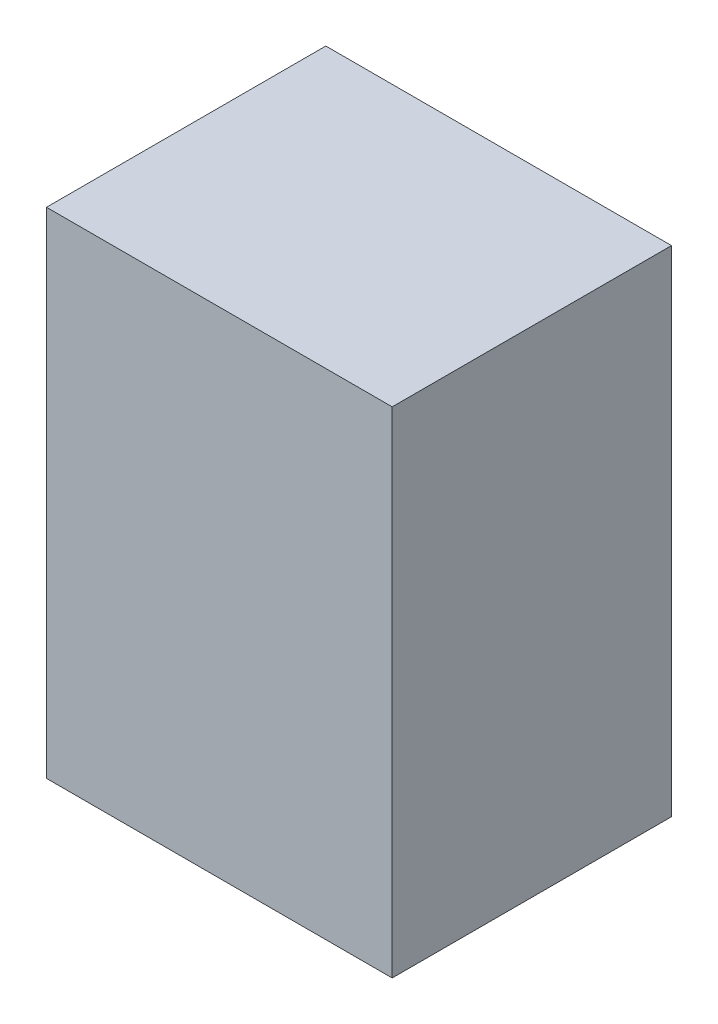
ISO-10303-21;
HEADER;
FILE_DESCRIPTION(('STEP AP214'),'2;1');
FILE_NAME('part.step','',(''),(''),'','','');
FILE_SCHEMA(('AUTOMOTIVE_DESIGN { 1 0 10303 214 1 1 1 1 }'));
ENDSEC;
DATA;
#1=APPLICATION_CONTEXT('core data for automotive mechanical design processes');
#2=APPLICATION_PROTOCOL_DEFINITION('international standard','automotive_design',2000,#1);
#3=PRODUCT_CONTEXT('',#1,'mechanical');
#4=PRODUCT('Part','Part','',(#3));
#5=PRODUCT_RELATED_PRODUCT_CATEGORY('part','',(#4));
#6=PRODUCT_DEFINITION_FORMATION('','',#4);
#7=PRODUCT_DEFINITION_CONTEXT('part definition',#1,'design');
#8=PRODUCT_DEFINITION('design','',#6,#7);
#9=PRODUCT_DEFINITION_SHAPE('','',#8);
#10=(LENGTH_UNIT() NAMED_UNIT(*) SI_UNIT(.MILLI.,.METRE.));
#11=(NAMED_UNIT(*) PLANE_ANGLE_UNIT() SI_UNIT($,.RADIAN.));
#12=(NAMED_UNIT(*) SI_UNIT($,.STERADIAN.) SOLID_ANGLE_UNIT());
#13=UNCERTAINTY_MEASURE_WITH_UNIT(LENGTH_MEASURE(1.E-05),#10,'distance_accuracy_value','');
#14=(GEOMETRIC_REPRESENTATION_CONTEXT(3) GLOBAL_UNCERTAINTY_ASSIGNED_CONTEXT((#13)) GLOBAL_UNIT_ASSIGNED_CONTEXT((#10,
#11,#12)) REPRESENTATION_CONTEXT('',''));
#15=CARTESIAN_POINT('',(0.,0.,0.));
#16=DIRECTION('',(0.,0.,1.));
#17=DIRECTION('',(1.,0.,0.));
#18=AXIS2_PLACEMENT_3D('',#15,#16,#17);
#19=CARTESIAN_POINT('',(-109.445182115135,-28.4537434587877,457.2));
#20=DIRECTION('',(1.,0.,0.));
#21=DIRECTION('',(0.,1.,0.));
#22=AXIS2_PLACEMENT_3D('',#19,#20,#21);
#23=PLANE('',#22);
#24=DIRECTION('',(0.,-1.,0.));
#25=VECTOR('',#24,1.);
#26=CARTESIAN_POINT('',(-109.445182115135,-28.4537434587877,0.));
#27=LINE('',#26,#25);
#28=CARTESIAN_POINT('',(-109.445182115135,-28.4537434587877,0.));
#29=VERTEX_POINT('',#28);
#30=CARTESIAN_POINT('',(-109.445182115135,-865.129743458788,0.));
#31=VERTEX_POINT('',#30);
#32=EDGE_CURVE('E126',#29,#31,#27,.T.);
#33=ORIENTED_EDGE('',*,*,#32,.T.);
#34=DIRECTION('',(0.,0.,-1.));
#35=VECTOR('',#34,1.);
#36=CARTESIAN_POINT('',(-109.445182115135,-865.129743458788,457.2));
#37=LINE('',#36,#35);
#38=CARTESIAN_POINT('',(-109.445182115135,-865.129743458788,472.44));
#39=VERTEX_POINT('',#38);
#40=EDGE_CURVE('E11',#39,#31,#37,.T.);
#41=ORIENTED_EDGE('',*,*,#40,.F.);
#42=DIRECTION('',(0.,-1.,0.));
#43=VECTOR('',#42,1.);
#44=CARTESIAN_POINT('',(-109.445182115135,-28.4537434587877,472.44));
#45=LINE('',#44,#43);
#46=CARTESIAN_POINT('',(-109.445182115135,-28.4537434587877,472.44));
#47=VERTEX_POINT('',#46);
#48=EDGE_CURVE('E124',#47,#39,#45,.T.);
#49=ORIENTED_EDGE('',*,*,#48,.F.);
#50=DIRECTION('',(0.,0.,-1.));
#51=VECTOR('',#50,1.);
#52=CARTESIAN_POINT('',(-109.445182115135,-28.4537434587877,457.2));
#53=LINE('',#52,#51);
#54=EDGE_CURVE('E163',#47,#29,#53,.T.);
#55=ORIENTED_EDGE('',*,*,#54,.T.);
#56=EDGE_LOOP('',(#33,#41,#49,#55));
#57=FACE_BOUND('',#56,.T.);
#58=ADVANCED_FACE('F45',(#57),#23,.F.);
#59=CARTESIAN_POINT('',(-96.7451821151352,-852.429743458787,457.2));
#60=DIRECTION('',(-1.,0.,0.));
#61=DIRECTION('',(0.,0.,1.));
#62=AXIS2_PLACEMENT_3D('',#59,#60,#61);
#63=PLANE('',#62);
#64=DIRECTION('',(0.,1.,0.));
#65=VECTOR('',#64,1.);
#66=CARTESIAN_POINT('',(-96.7451821151352,-852.429743458787,0.));
#67=LINE('',#66,#65);
#68=CARTESIAN_POINT('',(-96.7451821151352,-865.129743458788,0.));
#69=VERTEX_POINT('',#68);
#70=CARTESIAN_POINT('',(-96.7451821151352,-41.1537434587877,0.));
#71=VERTEX_POINT('',#70);
#72=EDGE_CURVE('E169',#69,#71,#67,.T.);
#73=ORIENTED_EDGE('',*,*,#72,.T.);
#74=DIRECTION('',(0.,0.,-1.));
#75=VECTOR('',#74,1.);
#76=CARTESIAN_POINT('',(-96.7451821151352,-41.1537434587877,457.2));
#77=LINE('',#76,#75);
#78=CARTESIAN_POINT('',(-96.7451821151352,-41.1537434587877,457.2));
#79=VERTEX_POINT('',#78);
#80=EDGE_CURVE('E198',#79,#71,#77,.T.);
#81=ORIENTED_EDGE('',*,*,#80,.F.);
#82=DIRECTION('',(0.,1.,0.));
#83=VECTOR('',#82,1.);
#84=CARTESIAN_POINT('',(-96.7451821151352,-852.429743458787,457.2));
#85=LINE('',#84,#83);
#86=CARTESIAN_POINT('',(-96.7451821151352,-865.129743458788,457.2));
#87=VERTEX_POINT('',#86);
#88=EDGE_CURVE('E151',#87,#79,#85,.T.);
#89=ORIENTED_EDGE('',*,*,#88,.F.);
#90=DIRECTION('',(0.,0.,-1.));
#91=VECTOR('',#90,1.);
#92=CARTESIAN_POINT('',(-96.7451821151352,-865.129743458788,457.2));
#93=LINE('',#92,#91);
#94=EDGE_CURVE('E54',#87,#69,#93,.T.);
#95=ORIENTED_EDGE('',*,*,#94,.T.);
#96=EDGE_LOOP('',(#73,#81,#89,#95));
#97=FACE_BOUND('',#96,.T.);
#98=ADVANCED_FACE('F203',(#97),#63,.F.);
#99=CARTESIAN_POINT('',(-96.7451821151352,-41.1537434587877,457.2));
#100=DIRECTION('',(0.,1.,0.));
#101=DIRECTION('',(0.,0.,1.));
#102=AXIS2_PLACEMENT_3D('',#99,#100,#101);
#103=PLANE('',#102);
#104=DIRECTION('',(1.,0.,0.));
#105=VECTOR('',#104,1.);
#106=CARTESIAN_POINT('',(-96.7451821151352,-41.1537434587877,0.));
#107=LINE('',#106,#105);
#108=CARTESIAN_POINT('',(462.562817884865,-41.1537434587877,0.));
#109=VERTEX_POINT('',#108);
#110=EDGE_CURVE('E172',#71,#109,#107,.T.);
#111=ORIENTED_EDGE('',*,*,#110,.T.);
#112=DIRECTION('',(0.,0.,-1.));
#113=VECTOR('',#112,1.);
#114=CARTESIAN_POINT('',(462.562817884865,-41.1537434587877,457.2));
#115=LINE('',#114,#113);
#116=CARTESIAN_POINT('',(462.562817884865,-41.1537434587877,457.2));
#117=VERTEX_POINT('',#116);
#118=EDGE_CURVE('E62',#117,#109,#115,.T.);
#119=ORIENTED_EDGE('',*,*,#118,.F.);
#120=DIRECTION('',(1.,0.,0.));
#121=VECTOR('',#120,1.);
#122=CARTESIAN_POINT('',(-96.7451821151352,-41.1537434587877,457.2));
#123=LINE('',#122,#121);
#124=EDGE_CURVE('E155',#79,#117,#123,.T.);
#125=ORIENTED_EDGE('',*,*,#124,.F.);
#126=ORIENTED_EDGE('',*,*,#80,.T.);
#127=EDGE_LOOP('',(#111,#119,#125,#126));
#128=FACE_BOUND('',#127,.T.);
#129=ADVANCED_FACE('F212',(#128),#103,.F.);
#130=CARTESIAN_POINT('',(462.562817884865,-836.173743458788,457.2));
#131=DIRECTION('',(1.,0.,0.));
#132=DIRECTION('',(0.,1.,0.));
#133=AXIS2_PLACEMENT_3D('',#130,#131,#132);
#134=PLANE('',#133);
#135=DIRECTION('',(0.,-1.,0.));
#136=VECTOR('',#135,1.);
#137=CARTESIAN_POINT('',(462.562817884865,-836.173743458788,0.));
#138=LINE('',#137,#136);
#139=CARTESIAN_POINT('',(462.562817884865,-865.129743458788,0.));
#140=VERTEX_POINT('',#139);
#141=EDGE_CURVE('E175',#109,#140,#138,.T.);
#142=ORIENTED_EDGE('',*,*,#141,.T.);
#143=DIRECTION('',(0.,0.,-1.));
#144=VECTOR('',#143,1.);
#145=CARTESIAN_POINT('',(462.562817884865,-865.129743458788,457.2));
#146=LINE('',#145,#144);
#147=CARTESIAN_POINT('',(462.562817884865,-865.129743458788,457.2));
#148=VERTEX_POINT('',#147);
#149=EDGE_CURVE('E192',#148,#140,#146,.T.);
#150=ORIENTED_EDGE('',*,*,#149,.F.);
#151=DIRECTION('',(0.,-1.,0.));
#152=VECTOR('',#151,1.);
#153=CARTESIAN_POINT('',(462.562817884865,-836.173743458788,457.2));
#154=LINE('',#153,#152);
#155=EDGE_CURVE('E159',#117,#148,#154,.T.);
#156=ORIENTED_EDGE('',*,*,#155,.F.);
#157=ORIENTED_EDGE('',*,*,#118,.T.);
#158=EDGE_LOOP('',(#142,#150,#156,#157));
#159=FACE_BOUND('',#158,.T.);
#160=ADVANCED_FACE('F213',(#159),#134,.F.);
#161=CARTESIAN_POINT('',(462.562817884865,-865.129743458788,457.2));
#162=DIRECTION('',(0.,1.,0.));
#163=DIRECTION('',(0.,0.,1.));
#164=AXIS2_PLACEMENT_3D('',#161,#162,#163);
#165=PLANE('',#164);
#166=DIRECTION('',(1.,0.,0.));
#167=VECTOR('',#166,1.);
#168=CARTESIAN_POINT('',(462.562817884865,-865.129743458788,0.));
#169=LINE('',#168,#167);
#170=CARTESIAN_POINT('',(475.262817884865,-865.129743458788,0.));
#171=VERTEX_POINT('',#170);
#172=EDGE_CURVE('E178',#140,#171,#169,.T.);
#173=ORIENTED_EDGE('',*,*,#172,.T.);
#174=DIRECTION('',(0.,0.,-1.));
#175=VECTOR('',#174,1.);
#176=CARTESIAN_POINT('',(475.262817884865,-865.129743458788,457.2));
#177=LINE('',#176,#175);
#178=CARTESIAN_POINT('',(475.262817884865,-865.129743458788,472.44));
#179=VERTEX_POINT('',#178);
#180=EDGE_CURVE('E130',#179,#171,#177,.T.);
#181=ORIENTED_EDGE('',*,*,#180,.F.);
#182=DIRECTION('',(1.,0.,0.));
#183=VECTOR('',#182,1.);
#184=CARTESIAN_POINT('',(-109.445182115135,-865.129743458788,472.44));
#185=LINE('',#184,#183);
#186=EDGE_CURVE('E128',#39,#179,#185,.T.);
#187=ORIENTED_EDGE('',*,*,#186,.F.);
#188=ORIENTED_EDGE('',*,*,#40,.T.);
#189=DIRECTION('',(1.,0.,0.));
#190=VECTOR('',#189,1.);
#191=CARTESIAN_POINT('',(-109.445182115135,-865.129743458788,0.));
#192=LINE('',#191,#190);
#193=EDGE_CURVE('E166',#31,#69,#192,.T.);
#194=ORIENTED_EDGE('',*,*,#193,.T.);
#195=ORIENTED_EDGE('',*,*,#94,.F.);
#196=DIRECTION('',(1.,0.,0.));
#197=VECTOR('',#196,1.);
#198=CARTESIAN_POINT('',(-109.445182115135,-865.129743458788,457.2));
#199=LINE('',#198,#197);
#200=EDGE_CURVE('E142',#87,#148,#199,.T.);
#201=ORIENTED_EDGE('',*,*,#200,.T.);
#202=ORIENTED_EDGE('',*,*,#149,.T.);
#203=EDGE_LOOP('',(#173,#181,#187,#188,#194,#195,#201,#202));
#204=FACE_BOUND('',#203,.T.);
#205=ADVANCED_FACE('F129',(#204),#165,.F.);
#206=CARTESIAN_POINT('',(475.262817884865,-28.4537434587877,457.2));
#207=DIRECTION('',(-1.,0.,0.));
#208=DIRECTION('',(0.,-1.,0.));
#209=AXIS2_PLACEMENT_3D('',#206,#207,#208);
#210=PLANE('',#209);
#211=DIRECTION('',(0.,1.,0.));
#212=VECTOR('',#211,1.);
#213=CARTESIAN_POINT('',(475.262817884865,-28.4537434587877,0.));
#214=LINE('',#213,#212);
#215=CARTESIAN_POINT('',(475.262817884865,-28.4537434587877,0.));
#216=VERTEX_POINT('',#215);
#217=EDGE_CURVE('E93',#171,#216,#214,.T.);
#218=ORIENTED_EDGE('',*,*,#217,.T.);
#219=DIRECTION('',(0.,0.,-1.));
#220=VECTOR('',#219,1.);
#221=CARTESIAN_POINT('',(475.262817884865,-28.4537434587877,457.2));
#222=LINE('',#221,#220);
#223=CARTESIAN_POINT('',(475.262817884865,-28.4537434587877,472.44));
#224=VERTEX_POINT('',#223);
#225=EDGE_CURVE('E187',#224,#216,#222,.T.);
#226=ORIENTED_EDGE('',*,*,#225,.F.);
#227=DIRECTION('',(0.,1.,0.));
#228=VECTOR('',#227,1.);
#229=CARTESIAN_POINT('',(475.262817884865,-28.4537434587877,472.44));
#230=LINE('',#229,#228);
#231=EDGE_CURVE('E135',#179,#224,#230,.T.);
#232=ORIENTED_EDGE('',*,*,#231,.F.);
#233=ORIENTED_EDGE('',*,*,#180,.T.);
#234=EDGE_LOOP('',(#218,#226,#232,#233));
#235=FACE_BOUND('',#234,.T.);
#236=ADVANCED_FACE('F220',(#235),#210,.F.);
#237=CARTESIAN_POINT('',(-109.445182115135,-28.4537434587877,457.2));
#238=DIRECTION('',(0.,-1.,0.));
#239=DIRECTION('',(0.,0.,-1.));
#240=AXIS2_PLACEMENT_3D('',#237,#238,#239);
#241=PLANE('',#240);
#242=DIRECTION('',(-1.,0.,0.));
#243=VECTOR('',#242,1.);
#244=CARTESIAN_POINT('',(-109.445182115135,-28.4537434587877,0.));
#245=LINE('',#244,#243);
#246=EDGE_CURVE('E99',#216,#29,#245,.T.);
#247=ORIENTED_EDGE('',*,*,#246,.T.);
#248=ORIENTED_EDGE('',*,*,#54,.F.);
#249=DIRECTION('',(-1.,0.,0.));
#250=VECTOR('',#249,1.);
#251=CARTESIAN_POINT('',(-109.445182115135,-28.4537434587877,472.44));
#252=LINE('',#251,#250);
#253=EDGE_CURVE('E140',#224,#47,#252,.T.);
#254=ORIENTED_EDGE('',*,*,#253,.F.);
#255=ORIENTED_EDGE('',*,*,#225,.T.);
#256=EDGE_LOOP('',(#247,#248,#254,#255));
#257=FACE_BOUND('',#256,.T.);
#258=ADVANCED_FACE('F257',(#257),#241,.F.);
#259=CARTESIAN_POINT('',(0.,0.,0.));
#260=DIRECTION('',(0.,0.,1.));
#261=DIRECTION('',(1.,0.,0.));
#262=AXIS2_PLACEMENT_3D('',#259,#260,#261);
#263=PLANE('',#262);
#264=ORIENTED_EDGE('',*,*,#32,.F.);
#265=ORIENTED_EDGE('',*,*,#246,.F.);
#266=ORIENTED_EDGE('',*,*,#217,.F.);
#267=ORIENTED_EDGE('',*,*,#172,.F.);
#268=ORIENTED_EDGE('',*,*,#141,.F.);
#269=ORIENTED_EDGE('',*,*,#110,.F.);
#270=ORIENTED_EDGE('',*,*,#72,.F.);
#271=ORIENTED_EDGE('',*,*,#193,.F.);
#272=EDGE_LOOP('',(#264,#265,#266,#267,#268,#269,#270,#271));
#273=FACE_BOUND('',#272,.T.);
#274=ADVANCED_FACE('F210',(#273),#263,.F.);
#275=CARTESIAN_POINT('',(0.,0.,457.2));
#276=DIRECTION('',(0.,0.,1.));
#277=DIRECTION('',(1.,0.,0.));
#278=AXIS2_PLACEMENT_3D('',#275,#276,#277);
#279=PLANE('',#278);
#280=ORIENTED_EDGE('',*,*,#200,.F.);
#281=ORIENTED_EDGE('',*,*,#88,.T.);
#282=ORIENTED_EDGE('',*,*,#124,.T.);
#283=ORIENTED_EDGE('',*,*,#155,.T.);
#284=EDGE_LOOP('',(#280,#281,#282,#283));
#285=FACE_BOUND('',#284,.T.);
#286=ADVANCED_FACE('F206',(#285),#279,.F.);
#287=CARTESIAN_POINT('',(0.,0.,472.44));
#288=DIRECTION('',(0.,0.,1.));
#289=DIRECTION('',(1.,0.,0.));
#290=AXIS2_PLACEMENT_3D('',#287,#288,#289);
#291=PLANE('',#290);
#292=ORIENTED_EDGE('',*,*,#48,.T.);
#293=ORIENTED_EDGE('',*,*,#186,.T.);
#294=ORIENTED_EDGE('',*,*,#231,.T.);
#295=ORIENTED_EDGE('',*,*,#253,.T.);
#296=EDGE_LOOP('',(#292,#293,#294,#295));
#297=FACE_BOUND('',#296,.T.);
#298=ADVANCED_FACE('F138',(#297),#291,.T.);
#299=CLOSED_SHELL('',(#58,#98,#129,#160,#205,#236,#258,#274,#286,#298));
#300=MANIFOLD_SOLID_BREP('B2',#299);
#301=ADVANCED_BREP_SHAPE_REPRESENTATION('',(#18,#300),#14);
#302=SHAPE_DEFINITION_REPRESENTATION(#9,#301);
ENDSEC;
END-ISO-10303-21;
